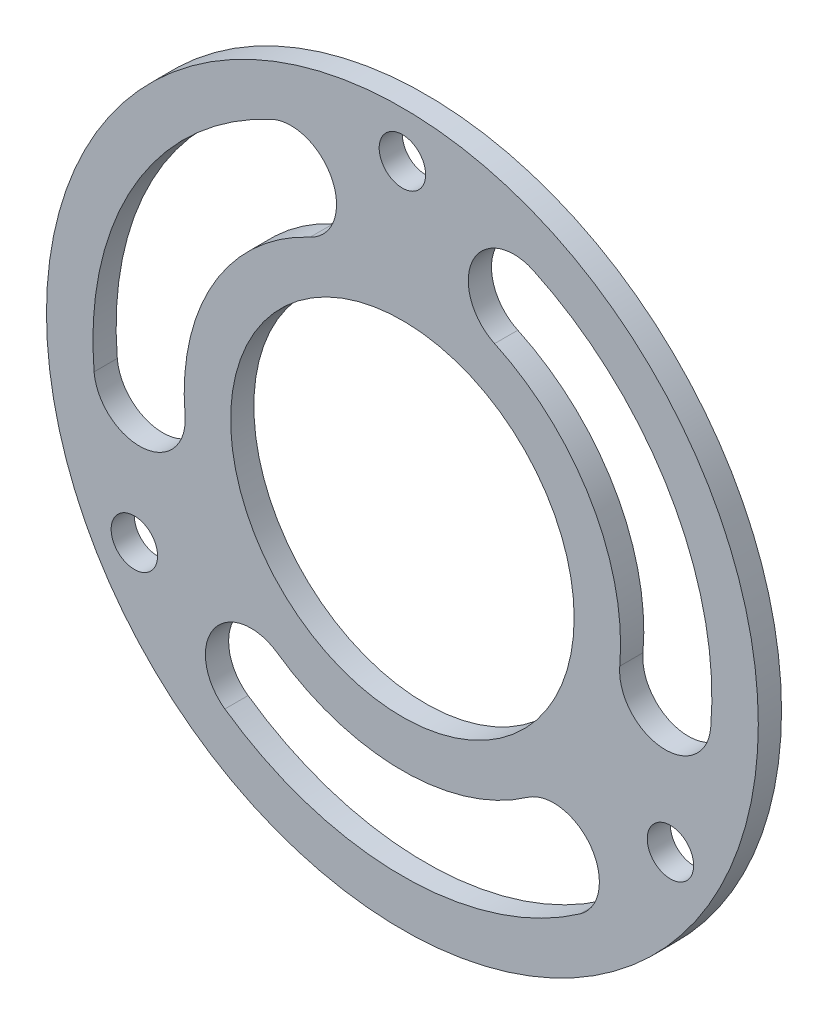
ISO-10303-21;
HEADER;
FILE_DESCRIPTION(('STEP AP214'),'2;1');
FILE_NAME('part.step','',(''),(''),'','','');
FILE_SCHEMA(('AUTOMOTIVE_DESIGN { 1 0 10303 214 1 1 1 1 }'));
ENDSEC;
DATA;
#1=APPLICATION_CONTEXT('core data for automotive mechanical design processes');
#2=APPLICATION_PROTOCOL_DEFINITION('international standard','automotive_design',2000,#1);
#3=PRODUCT_CONTEXT('',#1,'mechanical');
#4=PRODUCT('Part','Part','',(#3));
#5=PRODUCT_RELATED_PRODUCT_CATEGORY('part','',(#4));
#6=PRODUCT_DEFINITION_FORMATION('','',#4);
#7=PRODUCT_DEFINITION_CONTEXT('part definition',#1,'design');
#8=PRODUCT_DEFINITION('design','',#6,#7);
#9=PRODUCT_DEFINITION_SHAPE('','',#8);
#10=(LENGTH_UNIT() NAMED_UNIT(*) SI_UNIT(.MILLI.,.METRE.));
#11=(NAMED_UNIT(*) PLANE_ANGLE_UNIT() SI_UNIT($,.RADIAN.));
#12=(NAMED_UNIT(*) SI_UNIT($,.STERADIAN.) SOLID_ANGLE_UNIT());
#13=UNCERTAINTY_MEASURE_WITH_UNIT(LENGTH_MEASURE(1.E-05),#10,'distance_accuracy_value','');
#14=(GEOMETRIC_REPRESENTATION_CONTEXT(3) GLOBAL_UNCERTAINTY_ASSIGNED_CONTEXT((#13)) GLOBAL_UNIT_ASSIGNED_CONTEXT((#10,
#11,#12)) REPRESENTATION_CONTEXT('',''));
#15=CARTESIAN_POINT('',(0.,0.,0.));
#16=DIRECTION('',(0.,0.,1.));
#17=DIRECTION('',(1.,0.,0.));
#18=AXIS2_PLACEMENT_3D('',#15,#16,#17);
#19=CARTESIAN_POINT('',(0.,0.,1.5));
#20=DIRECTION('',(0.,0.,1.));
#21=DIRECTION('',(1.,0.,0.));
#22=AXIS2_PLACEMENT_3D('',#19,#20,#21);
#23=PLANE('',#22);
#24=CARTESIAN_POINT('',(-9.77947823978542,-13.9665423551273,1.5));
#25=DIRECTION('',(0.,0.,1.));
#26=DIRECTION('',(1.,0.,0.));
#27=AXIS2_PLACEMENT_3D('',#24,#25,#26);
#28=CIRCLE('',#27,2.95000000000001);
#29=CARTESIAN_POINT('',(-8.08742775254981,-11.5500438244747,1.5));
#30=VERTEX_POINT('',#29);
#31=CARTESIAN_POINT('',(-11.471528727021,-16.3830408857798,1.5));
#32=VERTEX_POINT('',#31);
#33=EDGE_CURVE('E51',#30,#32,#28,.T.);
#34=ORIENTED_EDGE('',*,*,#33,.F.);
#35=CARTESIAN_POINT('',(0.,0.,1.5));
#36=DIRECTION('',(0.,0.,-1.));
#37=DIRECTION('',(1.,0.,0.));
#38=AXIS2_PLACEMENT_3D('',#35,#36,#37);
#39=CIRCLE('',#38,14.1);
#40=CARTESIAN_POINT('',(8.08742775254982,-11.5500438244747,1.5));
#41=VERTEX_POINT('',#40);
#42=EDGE_CURVE('E170',#41,#30,#39,.T.);
#43=ORIENTED_EDGE('',*,*,#42,.F.);
#44=CARTESIAN_POINT('',(9.77947823978542,-13.9665423551272,1.5));
#45=DIRECTION('',(0.,0.,1.));
#46=DIRECTION('',(1.,0.,0.));
#47=AXIS2_PLACEMENT_3D('',#44,#45,#46);
#48=CIRCLE('',#47,2.95);
#49=CARTESIAN_POINT('',(11.471528727021,-16.3830408857798,1.5));
#50=VERTEX_POINT('',#49);
#51=EDGE_CURVE('E184',#50,#41,#48,.T.);
#52=ORIENTED_EDGE('',*,*,#51,.F.);
#53=CARTESIAN_POINT('',(0.,0.,1.5));
#54=DIRECTION('',(0.,0.,1.));
#55=DIRECTION('',(1.,0.,0.));
#56=AXIS2_PLACEMENT_3D('',#53,#54,#55);
#57=CIRCLE('',#56,20.);
#58=EDGE_CURVE('E181',#32,#50,#57,.T.);
#59=ORIENTED_EDGE('',*,*,#58,.F.);
#60=EDGE_LOOP('',(#34,#43,#52,#59));
#61=FACE_BOUND('',#60,.T.);
#62=CARTESIAN_POINT('',(16.9851196024642,-1.48600541384767,1.5));
#63=DIRECTION('',(0.,0.,1.));
#64=DIRECTION('',(1.,0.,0.));
#65=AXIS2_PLACEMENT_3D('',#62,#63,#64);
#66=CIRCLE('',#65,2.95);
#67=CARTESIAN_POINT('',(14.0463452430936,-1.22889597274206,1.5));
#68=VERTEX_POINT('',#67);
#69=CARTESIAN_POINT('',(19.9238939618349,-1.74311485495327,1.5));
#70=VERTEX_POINT('',#69);
#71=EDGE_CURVE('E59',#68,#70,#66,.T.);
#72=ORIENTED_EDGE('',*,*,#71,.F.);
#73=CARTESIAN_POINT('',(0.,0.,1.5));
#74=DIRECTION('',(0.,0.,-1.));
#75=DIRECTION('',(1.,0.,0.));
#76=AXIS2_PLACEMENT_3D('',#73,#74,#75);
#77=CIRCLE('',#76,14.1);
#78=CARTESIAN_POINT('',(5.95891749054378,12.7789397972168,1.5));
#79=VERTEX_POINT('',#78);
#80=EDGE_CURVE('E146',#79,#68,#77,.T.);
#81=ORIENTED_EDGE('',*,*,#80,.F.);
#82=CARTESIAN_POINT('',(7.20564136267882,15.4525477689749,1.5));
#83=DIRECTION('',(0.,0.,1.));
#84=DIRECTION('',(1.,0.,0.));
#85=AXIS2_PLACEMENT_3D('',#82,#83,#84);
#86=CIRCLE('',#85,2.95);
#87=CARTESIAN_POINT('',(8.45236523481387,18.1261557407331,1.5));
#88=VERTEX_POINT('',#87);
#89=EDGE_CURVE('E149',#88,#79,#86,.T.);
#90=ORIENTED_EDGE('',*,*,#89,.F.);
#91=CARTESIAN_POINT('',(0.,0.,1.5));
#92=DIRECTION('',(0.,0.,1.));
#93=DIRECTION('',(1.,0.,0.));
#94=AXIS2_PLACEMENT_3D('',#91,#92,#93);
#95=CIRCLE('',#94,20.);
#96=EDGE_CURVE('E155',#70,#88,#95,.T.);
#97=ORIENTED_EDGE('',*,*,#96,.F.);
#98=EDGE_LOOP('',(#72,#81,#90,#97));
#99=FACE_BOUND('',#98,.T.);
#100=CARTESIAN_POINT('',(-7.20564136267883,15.4525477689749,1.5));
#101=DIRECTION('',(0.,0.,1.));
#102=DIRECTION('',(1.,0.,0.));
#103=AXIS2_PLACEMENT_3D('',#100,#101,#102);
#104=CIRCLE('',#103,2.95);
#105=CARTESIAN_POINT('',(-5.95891749054379,12.7789397972168,1.5));
#106=VERTEX_POINT('',#105);
#107=CARTESIAN_POINT('',(-8.45236523481388,18.1261557407331,1.5));
#108=VERTEX_POINT('',#107);
#109=EDGE_CURVE('E162',#106,#108,#104,.T.);
#110=ORIENTED_EDGE('',*,*,#109,.F.);
#111=CARTESIAN_POINT('',(0.,0.,1.5));
#112=DIRECTION('',(0.,0.,-1.));
#113=DIRECTION('',(1.,0.,0.));
#114=AXIS2_PLACEMENT_3D('',#111,#112,#113);
#115=CIRCLE('',#114,14.1);
#116=CARTESIAN_POINT('',(-14.0463452430936,-1.22889597274207,1.5));
#117=VERTEX_POINT('',#116);
#118=EDGE_CURVE('E199',#117,#106,#115,.T.);
#119=ORIENTED_EDGE('',*,*,#118,.F.);
#120=CARTESIAN_POINT('',(-16.9851196024642,-1.48600541384768,1.5));
#121=DIRECTION('',(0.,0.,1.));
#122=DIRECTION('',(1.,0.,0.));
#123=AXIS2_PLACEMENT_3D('',#120,#121,#122);
#124=CIRCLE('',#123,2.95);
#125=CARTESIAN_POINT('',(-19.9238939618349,-1.74311485495329,1.5));
#126=VERTEX_POINT('',#125);
#127=EDGE_CURVE('E213',#126,#117,#124,.T.);
#128=ORIENTED_EDGE('',*,*,#127,.F.);
#129=CARTESIAN_POINT('',(0.,0.,1.5));
#130=DIRECTION('',(0.,0.,1.));
#131=DIRECTION('',(1.,0.,0.));
#132=AXIS2_PLACEMENT_3D('',#129,#130,#131);
#133=CIRCLE('',#132,20.);
#134=EDGE_CURVE('E210',#108,#126,#133,.T.);
#135=ORIENTED_EDGE('',*,*,#134,.F.);
#136=EDGE_LOOP('',(#110,#119,#128,#135));
#137=FACE_BOUND('',#136,.T.);
#138=CARTESIAN_POINT('',(-17.3205080756888,-10.,1.5));
#139=DIRECTION('',(0.,0.,1.));
#140=DIRECTION('',(1.,0.,0.));
#141=AXIS2_PLACEMENT_3D('',#138,#139,#140);
#142=CIRCLE('',#141,1.5);
#143=CARTESIAN_POINT('',(-15.8205080756888,-10.,1.5));
#144=VERTEX_POINT('',#143);
#145=EDGE_CURVE('E233',#144,#144,#142,.T.);
#146=ORIENTED_EDGE('',*,*,#145,.F.);
#147=EDGE_LOOP('',(#146));
#148=FACE_BOUND('',#147,.T.);
#149=CARTESIAN_POINT('',(0.,20.,1.5));
#150=DIRECTION('',(0.,0.,1.));
#151=DIRECTION('',(1.,0.,0.));
#152=AXIS2_PLACEMENT_3D('',#149,#150,#151);
#153=CIRCLE('',#152,1.5);
#154=CARTESIAN_POINT('',(1.5,20.,1.5));
#155=VERTEX_POINT('',#154);
#156=EDGE_CURVE('E245',#155,#155,#153,.T.);
#157=ORIENTED_EDGE('',*,*,#156,.F.);
#158=EDGE_LOOP('',(#157));
#159=FACE_BOUND('',#158,.T.);
#160=CARTESIAN_POINT('',(0.,0.,1.5));
#161=DIRECTION('',(0.,0.,1.));
#162=DIRECTION('',(1.,0.,0.));
#163=AXIS2_PLACEMENT_3D('',#160,#161,#162);
#164=CIRCLE('',#163,23.);
#165=CARTESIAN_POINT('',(23.,0.,1.5));
#166=VERTEX_POINT('',#165);
#167=EDGE_CURVE('E11',#166,#166,#164,.T.);
#168=ORIENTED_EDGE('',*,*,#167,.T.);
#169=EDGE_LOOP('',(#168));
#170=FACE_BOUND('',#169,.T.);
#171=CARTESIAN_POINT('',(17.3205080756888,-10.,1.5));
#172=DIRECTION('',(0.,0.,1.));
#173=DIRECTION('',(1.,0.,0.));
#174=AXIS2_PLACEMENT_3D('',#171,#172,#173);
#175=CIRCLE('',#174,1.5);
#176=CARTESIAN_POINT('',(18.8205080756888,-10.,1.5));
#177=VERTEX_POINT('',#176);
#178=EDGE_CURVE('E239',#177,#177,#175,.T.);
#179=ORIENTED_EDGE('',*,*,#178,.F.);
#180=EDGE_LOOP('',(#179));
#181=FACE_BOUND('',#180,.T.);
#182=CARTESIAN_POINT('',(0.,0.,1.5));
#183=DIRECTION('',(0.,0.,1.));
#184=DIRECTION('',(1.,0.,0.));
#185=AXIS2_PLACEMENT_3D('',#182,#183,#184);
#186=CIRCLE('',#185,11.1);
#187=CARTESIAN_POINT('',(11.1,0.,1.5));
#188=VERTEX_POINT('',#187);
#189=EDGE_CURVE('E227',#188,#188,#186,.T.);
#190=ORIENTED_EDGE('',*,*,#189,.F.);
#191=EDGE_LOOP('',(#190));
#192=FACE_BOUND('',#191,.T.);
#193=ADVANCED_FACE('F36',(#61,#99,#137,#148,#159,#170,#181,#192),#23,.T.);
#194=CARTESIAN_POINT('',(0.,0.,0.));
#195=DIRECTION('',(0.,0.,1.));
#196=DIRECTION('',(1.,0.,0.));
#197=AXIS2_PLACEMENT_3D('',#194,#195,#196);
#198=PLANE('',#197);
#199=CARTESIAN_POINT('',(0.,0.,0.));
#200=DIRECTION('',(0.,0.,-1.));
#201=DIRECTION('',(1.,0.,0.));
#202=AXIS2_PLACEMENT_3D('',#199,#200,#201);
#203=CIRCLE('',#202,14.1);
#204=CARTESIAN_POINT('',(8.08742775254982,-11.5500438244747,0.));
#205=VERTEX_POINT('',#204);
#206=CARTESIAN_POINT('',(-8.08742775254981,-11.5500438244747,0.));
#207=VERTEX_POINT('',#206);
#208=EDGE_CURVE('E176',#205,#207,#203,.T.);
#209=ORIENTED_EDGE('',*,*,#208,.T.);
#210=CARTESIAN_POINT('',(-9.77947823978542,-13.9665423551273,0.));
#211=DIRECTION('',(0.,0.,1.));
#212=DIRECTION('',(1.,0.,0.));
#213=AXIS2_PLACEMENT_3D('',#210,#211,#212);
#214=CIRCLE('',#213,2.95000000000001);
#215=CARTESIAN_POINT('',(-11.471528727021,-16.3830408857798,0.));
#216=VERTEX_POINT('',#215);
#217=EDGE_CURVE('E166',#207,#216,#214,.T.);
#218=ORIENTED_EDGE('',*,*,#217,.T.);
#219=CARTESIAN_POINT('',(0.,0.,0.));
#220=DIRECTION('',(0.,0.,1.));
#221=DIRECTION('',(1.,0.,0.));
#222=AXIS2_PLACEMENT_3D('',#219,#220,#221);
#223=CIRCLE('',#222,20.);
#224=CARTESIAN_POINT('',(11.471528727021,-16.3830408857798,0.));
#225=VERTEX_POINT('',#224);
#226=EDGE_CURVE('E169',#216,#225,#223,.T.);
#227=ORIENTED_EDGE('',*,*,#226,.T.);
#228=CARTESIAN_POINT('',(9.77947823978542,-13.9665423551272,0.));
#229=DIRECTION('',(0.,0.,1.));
#230=DIRECTION('',(1.,0.,0.));
#231=AXIS2_PLACEMENT_3D('',#228,#229,#230);
#232=CIRCLE('',#231,2.95);
#233=EDGE_CURVE('E173',#225,#205,#232,.T.);
#234=ORIENTED_EDGE('',*,*,#233,.T.);
#235=EDGE_LOOP('',(#209,#218,#227,#234));
#236=FACE_BOUND('',#235,.T.);
#237=CARTESIAN_POINT('',(0.,0.,0.));
#238=DIRECTION('',(0.,0.,-1.));
#239=DIRECTION('',(1.,0.,0.));
#240=AXIS2_PLACEMENT_3D('',#237,#238,#239);
#241=CIRCLE('',#240,14.1);
#242=CARTESIAN_POINT('',(5.95891749054378,12.7789397972168,0.));
#243=VERTEX_POINT('',#242);
#244=CARTESIAN_POINT('',(14.0463452430936,-1.22889597274206,0.));
#245=VERTEX_POINT('',#244);
#246=EDGE_CURVE('E133',#243,#245,#241,.T.);
#247=ORIENTED_EDGE('',*,*,#246,.T.);
#248=CARTESIAN_POINT('',(16.9851196024642,-1.48600541384767,0.));
#249=DIRECTION('',(0.,0.,1.));
#250=DIRECTION('',(1.,0.,0.));
#251=AXIS2_PLACEMENT_3D('',#248,#249,#250);
#252=CIRCLE('',#251,2.95);
#253=CARTESIAN_POINT('',(19.9238939618349,-1.74311485495327,0.));
#254=VERTEX_POINT('',#253);
#255=EDGE_CURVE('E127',#245,#254,#252,.T.);
#256=ORIENTED_EDGE('',*,*,#255,.T.);
#257=CARTESIAN_POINT('',(0.,0.,0.));
#258=DIRECTION('',(0.,0.,1.));
#259=DIRECTION('',(1.,0.,0.));
#260=AXIS2_PLACEMENT_3D('',#257,#258,#259);
#261=CIRCLE('',#260,20.);
#262=CARTESIAN_POINT('',(8.45236523481387,18.1261557407331,0.));
#263=VERTEX_POINT('',#262);
#264=EDGE_CURVE('E137',#254,#263,#261,.T.);
#265=ORIENTED_EDGE('',*,*,#264,.T.);
#266=CARTESIAN_POINT('',(7.20564136267882,15.4525477689749,0.));
#267=DIRECTION('',(0.,0.,1.));
#268=DIRECTION('',(1.,0.,0.));
#269=AXIS2_PLACEMENT_3D('',#266,#267,#268);
#270=CIRCLE('',#269,2.95);
#271=EDGE_CURVE('E141',#263,#243,#270,.T.);
#272=ORIENTED_EDGE('',*,*,#271,.T.);
#273=EDGE_LOOP('',(#247,#256,#265,#272));
#274=FACE_BOUND('',#273,.T.);
#275=CARTESIAN_POINT('',(0.,0.,0.));
#276=DIRECTION('',(0.,0.,-1.));
#277=DIRECTION('',(1.,0.,0.));
#278=AXIS2_PLACEMENT_3D('',#275,#276,#277);
#279=CIRCLE('',#278,14.1);
#280=CARTESIAN_POINT('',(-14.0463452430936,-1.22889597274207,0.));
#281=VERTEX_POINT('',#280);
#282=CARTESIAN_POINT('',(-5.95891749054379,12.7789397972168,0.));
#283=VERTEX_POINT('',#282);
#284=EDGE_CURVE('E205',#281,#283,#279,.T.);
#285=ORIENTED_EDGE('',*,*,#284,.T.);
#286=CARTESIAN_POINT('',(-7.20564136267883,15.4525477689749,0.));
#287=DIRECTION('',(0.,0.,1.));
#288=DIRECTION('',(1.,0.,0.));
#289=AXIS2_PLACEMENT_3D('',#286,#287,#288);
#290=CIRCLE('',#289,2.95);
#291=CARTESIAN_POINT('',(-8.45236523481388,18.1261557407331,0.));
#292=VERTEX_POINT('',#291);
#293=EDGE_CURVE('E195',#283,#292,#290,.T.);
#294=ORIENTED_EDGE('',*,*,#293,.T.);
#295=CARTESIAN_POINT('',(0.,0.,0.));
#296=DIRECTION('',(0.,0.,1.));
#297=DIRECTION('',(1.,0.,0.));
#298=AXIS2_PLACEMENT_3D('',#295,#296,#297);
#299=CIRCLE('',#298,20.);
#300=CARTESIAN_POINT('',(-19.9238939618349,-1.74311485495329,0.));
#301=VERTEX_POINT('',#300);
#302=EDGE_CURVE('E198',#292,#301,#299,.T.);
#303=ORIENTED_EDGE('',*,*,#302,.T.);
#304=CARTESIAN_POINT('',(-16.9851196024642,-1.48600541384768,0.));
#305=DIRECTION('',(0.,0.,1.));
#306=DIRECTION('',(1.,0.,0.));
#307=AXIS2_PLACEMENT_3D('',#304,#305,#306);
#308=CIRCLE('',#307,2.95);
#309=EDGE_CURVE('E202',#301,#281,#308,.T.);
#310=ORIENTED_EDGE('',*,*,#309,.T.);
#311=EDGE_LOOP('',(#285,#294,#303,#310));
#312=FACE_BOUND('',#311,.T.);
#313=CARTESIAN_POINT('',(0.,0.,0.));
#314=DIRECTION('',(0.,0.,1.));
#315=DIRECTION('',(1.,0.,0.));
#316=AXIS2_PLACEMENT_3D('',#313,#314,#315);
#317=CIRCLE('',#316,23.);
#318=CARTESIAN_POINT('',(23.,0.,0.));
#319=VERTEX_POINT('',#318);
#320=EDGE_CURVE('E40',#319,#319,#317,.T.);
#321=ORIENTED_EDGE('',*,*,#320,.F.);
#322=EDGE_LOOP('',(#321));
#323=FACE_BOUND('',#322,.T.);
#324=CARTESIAN_POINT('',(0.,20.,0.));
#325=DIRECTION('',(0.,0.,1.));
#326=DIRECTION('',(1.,0.,0.));
#327=AXIS2_PLACEMENT_3D('',#324,#325,#326);
#328=CIRCLE('',#327,1.5);
#329=CARTESIAN_POINT('',(1.5,20.,0.));
#330=VERTEX_POINT('',#329);
#331=EDGE_CURVE('E242',#330,#330,#328,.T.);
#332=ORIENTED_EDGE('',*,*,#331,.T.);
#333=EDGE_LOOP('',(#332));
#334=FACE_BOUND('',#333,.T.);
#335=CARTESIAN_POINT('',(17.3205080756888,-10.,0.));
#336=DIRECTION('',(0.,0.,1.));
#337=DIRECTION('',(1.,0.,0.));
#338=AXIS2_PLACEMENT_3D('',#335,#336,#337);
#339=CIRCLE('',#338,1.5);
#340=CARTESIAN_POINT('',(18.8205080756888,-10.,0.));
#341=VERTEX_POINT('',#340);
#342=EDGE_CURVE('E236',#341,#341,#339,.T.);
#343=ORIENTED_EDGE('',*,*,#342,.T.);
#344=EDGE_LOOP('',(#343));
#345=FACE_BOUND('',#344,.T.);
#346=CARTESIAN_POINT('',(-17.3205080756888,-10.,0.));
#347=DIRECTION('',(0.,0.,1.));
#348=DIRECTION('',(1.,0.,0.));
#349=AXIS2_PLACEMENT_3D('',#346,#347,#348);
#350=CIRCLE('',#349,1.5);
#351=CARTESIAN_POINT('',(-15.8205080756888,-10.,0.));
#352=VERTEX_POINT('',#351);
#353=EDGE_CURVE('E230',#352,#352,#350,.T.);
#354=ORIENTED_EDGE('',*,*,#353,.T.);
#355=EDGE_LOOP('',(#354));
#356=FACE_BOUND('',#355,.T.);
#357=CARTESIAN_POINT('',(0.,0.,0.));
#358=DIRECTION('',(0.,0.,1.));
#359=DIRECTION('',(1.,0.,0.));
#360=AXIS2_PLACEMENT_3D('',#357,#358,#359);
#361=CIRCLE('',#360,11.1);
#362=CARTESIAN_POINT('',(11.1,0.,0.));
#363=VERTEX_POINT('',#362);
#364=EDGE_CURVE('E220',#363,#363,#361,.T.);
#365=ORIENTED_EDGE('',*,*,#364,.T.);
#366=EDGE_LOOP('',(#365));
#367=FACE_BOUND('',#366,.T.);
#368=ADVANCED_FACE('F143',(#236,#274,#312,#323,#334,#345,#356,#367),#198,.F.);
#369=CARTESIAN_POINT('',(0.,0.,1.5));
#370=DIRECTION('',(0.,0.,-1.));
#371=DIRECTION('',(-1.,0.,0.));
#372=AXIS2_PLACEMENT_3D('',#369,#370,#371);
#373=CYLINDRICAL_SURFACE('',#372,23.);
#374=ORIENTED_EDGE('',*,*,#167,.F.);
#375=EDGE_LOOP('',(#374));
#376=FACE_BOUND('',#375,.T.);
#377=ORIENTED_EDGE('',*,*,#320,.T.);
#378=EDGE_LOOP('',(#377));
#379=FACE_BOUND('',#378,.T.);
#380=ADVANCED_FACE('F38',(#376,#379),#373,.T.);
#381=CARTESIAN_POINT('',(0.,20.,1.5));
#382=DIRECTION('',(0.,0.,-1.));
#383=DIRECTION('',(-1.,0.,0.));
#384=AXIS2_PLACEMENT_3D('',#381,#382,#383);
#385=CYLINDRICAL_SURFACE('',#384,1.5);
#386=ORIENTED_EDGE('',*,*,#156,.T.);
#387=EDGE_LOOP('',(#386));
#388=FACE_BOUND('',#387,.T.);
#389=ORIENTED_EDGE('',*,*,#331,.F.);
#390=EDGE_LOOP('',(#389));
#391=FACE_BOUND('',#390,.T.);
#392=ADVANCED_FACE('F253',(#388,#391),#385,.F.);
#393=CARTESIAN_POINT('',(17.3205080756888,-10.,1.5));
#394=DIRECTION('',(0.,0.,-1.));
#395=DIRECTION('',(-1.,0.,0.));
#396=AXIS2_PLACEMENT_3D('',#393,#394,#395);
#397=CYLINDRICAL_SURFACE('',#396,1.5);
#398=ORIENTED_EDGE('',*,*,#178,.T.);
#399=EDGE_LOOP('',(#398));
#400=FACE_BOUND('',#399,.T.);
#401=ORIENTED_EDGE('',*,*,#342,.F.);
#402=EDGE_LOOP('',(#401));
#403=FACE_BOUND('',#402,.T.);
#404=ADVANCED_FACE('F255',(#400,#403),#397,.F.);
#405=CARTESIAN_POINT('',(-17.3205080756888,-10.,1.5));
#406=DIRECTION('',(0.,0.,-1.));
#407=DIRECTION('',(-1.,0.,0.));
#408=AXIS2_PLACEMENT_3D('',#405,#406,#407);
#409=CYLINDRICAL_SURFACE('',#408,1.5);
#410=ORIENTED_EDGE('',*,*,#145,.T.);
#411=EDGE_LOOP('',(#410));
#412=FACE_BOUND('',#411,.T.);
#413=ORIENTED_EDGE('',*,*,#353,.F.);
#414=EDGE_LOOP('',(#413));
#415=FACE_BOUND('',#414,.T.);
#416=ADVANCED_FACE('F262',(#412,#415),#409,.F.);
#417=CARTESIAN_POINT('',(0.,0.,1.5));
#418=DIRECTION('',(0.,0.,-1.));
#419=DIRECTION('',(-1.,0.,0.));
#420=AXIS2_PLACEMENT_3D('',#417,#418,#419);
#421=CYLINDRICAL_SURFACE('',#420,11.1);
#422=ORIENTED_EDGE('',*,*,#189,.T.);
#423=EDGE_LOOP('',(#422));
#424=FACE_BOUND('',#423,.T.);
#425=ORIENTED_EDGE('',*,*,#364,.F.);
#426=EDGE_LOOP('',(#425));
#427=FACE_BOUND('',#426,.T.);
#428=ADVANCED_FACE('F292',(#424,#427),#421,.F.);
#429=CARTESIAN_POINT('',(-7.20564136267883,15.4525477689749,0.));
#430=DIRECTION('',(0.,0.,1.));
#431=DIRECTION('',(1.,0.,0.));
#432=AXIS2_PLACEMENT_3D('',#429,#430,#431);
#433=CYLINDRICAL_SURFACE('',#432,2.95);
#434=ORIENTED_EDGE('',*,*,#109,.T.);
#435=DIRECTION('',(0.,0.,1.));
#436=VECTOR('',#435,1.);
#437=CARTESIAN_POINT('',(-8.45236523481388,18.1261557407331,0.));
#438=LINE('',#437,#436);
#439=EDGE_CURVE('E208',#292,#108,#438,.T.);
#440=ORIENTED_EDGE('',*,*,#439,.F.);
#441=ORIENTED_EDGE('',*,*,#293,.F.);
#442=DIRECTION('',(0.,0.,1.));
#443=VECTOR('',#442,1.);
#444=CARTESIAN_POINT('',(-5.95891749054379,12.7789397972168,0.));
#445=LINE('',#444,#443);
#446=EDGE_CURVE('E218',#283,#106,#445,.T.);
#447=ORIENTED_EDGE('',*,*,#446,.T.);
#448=EDGE_LOOP('',(#434,#440,#441,#447));
#449=FACE_BOUND('',#448,.T.);
#450=ADVANCED_FACE('F295',(#449),#433,.F.);
#451=CARTESIAN_POINT('',(0.,0.,0.));
#452=DIRECTION('',(0.,0.,1.));
#453=DIRECTION('',(1.,0.,0.));
#454=AXIS2_PLACEMENT_3D('',#451,#452,#453);
#455=CYLINDRICAL_SURFACE('',#454,14.1);
#456=ORIENTED_EDGE('',*,*,#118,.T.);
#457=ORIENTED_EDGE('',*,*,#446,.F.);
#458=ORIENTED_EDGE('',*,*,#284,.F.);
#459=DIRECTION('',(0.,0.,1.));
#460=VECTOR('',#459,1.);
#461=CARTESIAN_POINT('',(-14.0463452430936,-1.22889597274207,0.));
#462=LINE('',#461,#460);
#463=EDGE_CURVE('E221',#281,#117,#462,.T.);
#464=ORIENTED_EDGE('',*,*,#463,.T.);
#465=EDGE_LOOP('',(#456,#457,#458,#464));
#466=FACE_BOUND('',#465,.T.);
#467=ADVANCED_FACE('F303',(#466),#455,.T.);
#468=CARTESIAN_POINT('',(-16.9851196024642,-1.48600541384768,0.));
#469=DIRECTION('',(0.,0.,1.));
#470=DIRECTION('',(1.,0.,0.));
#471=AXIS2_PLACEMENT_3D('',#468,#469,#470);
#472=CYLINDRICAL_SURFACE('',#471,2.95);
#473=ORIENTED_EDGE('',*,*,#127,.T.);
#474=ORIENTED_EDGE('',*,*,#463,.F.);
#475=ORIENTED_EDGE('',*,*,#309,.F.);
#476=DIRECTION('',(0.,0.,1.));
#477=VECTOR('',#476,1.);
#478=CARTESIAN_POINT('',(-19.9238939618349,-1.74311485495329,0.));
#479=LINE('',#478,#477);
#480=EDGE_CURVE('E223',#301,#126,#479,.T.);
#481=ORIENTED_EDGE('',*,*,#480,.T.);
#482=EDGE_LOOP('',(#473,#474,#475,#481));
#483=FACE_BOUND('',#482,.T.);
#484=ADVANCED_FACE('F312',(#483),#472,.F.);
#485=CARTESIAN_POINT('',(0.,0.,0.));
#486=DIRECTION('',(0.,0.,1.));
#487=DIRECTION('',(1.,0.,0.));
#488=AXIS2_PLACEMENT_3D('',#485,#486,#487);
#489=CYLINDRICAL_SURFACE('',#488,20.);
#490=ORIENTED_EDGE('',*,*,#134,.T.);
#491=ORIENTED_EDGE('',*,*,#480,.F.);
#492=ORIENTED_EDGE('',*,*,#302,.F.);
#493=ORIENTED_EDGE('',*,*,#439,.T.);
#494=EDGE_LOOP('',(#490,#491,#492,#493));
#495=FACE_BOUND('',#494,.T.);
#496=ADVANCED_FACE('F309',(#495),#489,.F.);
#497=CARTESIAN_POINT('',(16.9851196024642,-1.48600541384767,0.));
#498=DIRECTION('',(0.,0.,1.));
#499=DIRECTION('',(1.,0.,0.));
#500=AXIS2_PLACEMENT_3D('',#497,#498,#499);
#501=CYLINDRICAL_SURFACE('',#500,2.95);
#502=ORIENTED_EDGE('',*,*,#71,.T.);
#503=DIRECTION('',(0.,0.,1.));
#504=VECTOR('',#503,1.);
#505=CARTESIAN_POINT('',(19.9238939618349,-1.74311485495327,0.));
#506=LINE('',#505,#504);
#507=EDGE_CURVE('E123',#254,#70,#506,.T.);
#508=ORIENTED_EDGE('',*,*,#507,.F.);
#509=ORIENTED_EDGE('',*,*,#255,.F.);
#510=DIRECTION('',(0.,0.,1.));
#511=VECTOR('',#510,1.);
#512=CARTESIAN_POINT('',(14.0463452430936,-1.22889597274206,0.));
#513=LINE('',#512,#511);
#514=EDGE_CURVE('E160',#245,#68,#513,.T.);
#515=ORIENTED_EDGE('',*,*,#514,.T.);
#516=EDGE_LOOP('',(#502,#508,#509,#515));
#517=FACE_BOUND('',#516,.T.);
#518=ADVANCED_FACE('F125',(#517),#501,.F.);
#519=CARTESIAN_POINT('',(0.,0.,0.));
#520=DIRECTION('',(0.,0.,1.));
#521=DIRECTION('',(1.,0.,0.));
#522=AXIS2_PLACEMENT_3D('',#519,#520,#521);
#523=CYLINDRICAL_SURFACE('',#522,14.1);
#524=ORIENTED_EDGE('',*,*,#80,.T.);
#525=ORIENTED_EDGE('',*,*,#514,.F.);
#526=ORIENTED_EDGE('',*,*,#246,.F.);
#527=DIRECTION('',(0.,0.,1.));
#528=VECTOR('',#527,1.);
#529=CARTESIAN_POINT('',(5.95891749054378,12.7789397972168,0.));
#530=LINE('',#529,#528);
#531=EDGE_CURVE('E163',#243,#79,#530,.T.);
#532=ORIENTED_EDGE('',*,*,#531,.T.);
#533=EDGE_LOOP('',(#524,#525,#526,#532));
#534=FACE_BOUND('',#533,.T.);
#535=ADVANCED_FACE('F337',(#534),#523,.T.);
#536=CARTESIAN_POINT('',(7.20564136267882,15.4525477689749,0.));
#537=DIRECTION('',(0.,0.,1.));
#538=DIRECTION('',(1.,0.,0.));
#539=AXIS2_PLACEMENT_3D('',#536,#537,#538);
#540=CYLINDRICAL_SURFACE('',#539,2.95);
#541=ORIENTED_EDGE('',*,*,#89,.T.);
#542=ORIENTED_EDGE('',*,*,#531,.F.);
#543=ORIENTED_EDGE('',*,*,#271,.F.);
#544=DIRECTION('',(0.,0.,1.));
#545=VECTOR('',#544,1.);
#546=CARTESIAN_POINT('',(8.45236523481387,18.1261557407331,0.));
#547=LINE('',#546,#545);
#548=EDGE_CURVE('E132',#263,#88,#547,.T.);
#549=ORIENTED_EDGE('',*,*,#548,.T.);
#550=EDGE_LOOP('',(#541,#542,#543,#549));
#551=FACE_BOUND('',#550,.T.);
#552=ADVANCED_FACE('F340',(#551),#540,.F.);
#553=CARTESIAN_POINT('',(0.,0.,0.));
#554=DIRECTION('',(0.,0.,1.));
#555=DIRECTION('',(1.,0.,0.));
#556=AXIS2_PLACEMENT_3D('',#553,#554,#555);
#557=CYLINDRICAL_SURFACE('',#556,20.);
#558=ORIENTED_EDGE('',*,*,#96,.T.);
#559=ORIENTED_EDGE('',*,*,#548,.F.);
#560=ORIENTED_EDGE('',*,*,#264,.F.);
#561=ORIENTED_EDGE('',*,*,#507,.T.);
#562=EDGE_LOOP('',(#558,#559,#560,#561));
#563=FACE_BOUND('',#562,.T.);
#564=ADVANCED_FACE('F138',(#563),#557,.F.);
#565=CARTESIAN_POINT('',(-9.77947823978542,-13.9665423551273,0.));
#566=DIRECTION('',(0.,0.,1.));
#567=DIRECTION('',(1.,0.,0.));
#568=AXIS2_PLACEMENT_3D('',#565,#566,#567);
#569=CYLINDRICAL_SURFACE('',#568,2.95000000000001);
#570=ORIENTED_EDGE('',*,*,#33,.T.);
#571=DIRECTION('',(0.,0.,1.));
#572=VECTOR('',#571,1.);
#573=CARTESIAN_POINT('',(-11.471528727021,-16.3830408857798,0.));
#574=LINE('',#573,#572);
#575=EDGE_CURVE('E179',#216,#32,#574,.T.);
#576=ORIENTED_EDGE('',*,*,#575,.F.);
#577=ORIENTED_EDGE('',*,*,#217,.F.);
#578=DIRECTION('',(0.,0.,1.));
#579=VECTOR('',#578,1.);
#580=CARTESIAN_POINT('',(-8.08742775254981,-11.5500438244747,0.));
#581=LINE('',#580,#579);
#582=EDGE_CURVE('E156',#207,#30,#581,.T.);
#583=ORIENTED_EDGE('',*,*,#582,.T.);
#584=EDGE_LOOP('',(#570,#576,#577,#583));
#585=FACE_BOUND('',#584,.T.);
#586=ADVANCED_FACE('F320',(#585),#569,.F.);
#587=CARTESIAN_POINT('',(0.,0.,0.));
#588=DIRECTION('',(0.,0.,1.));
#589=DIRECTION('',(1.,0.,0.));
#590=AXIS2_PLACEMENT_3D('',#587,#588,#589);
#591=CYLINDRICAL_SURFACE('',#590,14.1);
#592=ORIENTED_EDGE('',*,*,#42,.T.);
#593=ORIENTED_EDGE('',*,*,#582,.F.);
#594=ORIENTED_EDGE('',*,*,#208,.F.);
#595=DIRECTION('',(0.,0.,1.));
#596=VECTOR('',#595,1.);
#597=CARTESIAN_POINT('',(8.08742775254982,-11.5500438244747,0.));
#598=LINE('',#597,#596);
#599=EDGE_CURVE('E190',#205,#41,#598,.T.);
#600=ORIENTED_EDGE('',*,*,#599,.T.);
#601=EDGE_LOOP('',(#592,#593,#594,#600));
#602=FACE_BOUND('',#601,.T.);
#603=ADVANCED_FACE('F323',(#602),#591,.T.);
#604=CARTESIAN_POINT('',(9.77947823978542,-13.9665423551272,0.));
#605=DIRECTION('',(0.,0.,1.));
#606=DIRECTION('',(1.,0.,0.));
#607=AXIS2_PLACEMENT_3D('',#604,#605,#606);
#608=CYLINDRICAL_SURFACE('',#607,2.95);
#609=ORIENTED_EDGE('',*,*,#51,.T.);
#610=ORIENTED_EDGE('',*,*,#599,.F.);
#611=ORIENTED_EDGE('',*,*,#233,.F.);
#612=DIRECTION('',(0.,0.,1.));
#613=VECTOR('',#612,1.);
#614=CARTESIAN_POINT('',(11.471528727021,-16.3830408857798,0.));
#615=LINE('',#614,#613);
#616=EDGE_CURVE('E192',#225,#50,#615,.T.);
#617=ORIENTED_EDGE('',*,*,#616,.T.);
#618=EDGE_LOOP('',(#609,#610,#611,#617));
#619=FACE_BOUND('',#618,.T.);
#620=ADVANCED_FACE('F327',(#619),#608,.F.);
#621=CARTESIAN_POINT('',(0.,0.,0.));
#622=DIRECTION('',(0.,0.,1.));
#623=DIRECTION('',(1.,0.,0.));
#624=AXIS2_PLACEMENT_3D('',#621,#622,#623);
#625=CYLINDRICAL_SURFACE('',#624,20.);
#626=ORIENTED_EDGE('',*,*,#58,.T.);
#627=ORIENTED_EDGE('',*,*,#616,.F.);
#628=ORIENTED_EDGE('',*,*,#226,.F.);
#629=ORIENTED_EDGE('',*,*,#575,.T.);
#630=EDGE_LOOP('',(#626,#627,#628,#629));
#631=FACE_BOUND('',#630,.T.);
#632=ADVANCED_FACE('F324',(#631),#625,.F.);
#633=CLOSED_SHELL('',(#193,#368,#380,#392,#404,#416,#428,#450,#467,#484,#496,#518,#535,#552,
#564,#586,#603,#620,#632));
#634=MANIFOLD_SOLID_BREP('B2',#633);
#635=ADVANCED_BREP_SHAPE_REPRESENTATION('',(#18,#634),#14);
#636=SHAPE_DEFINITION_REPRESENTATION(#9,#635);
ENDSEC;
END-ISO-10303-21;
